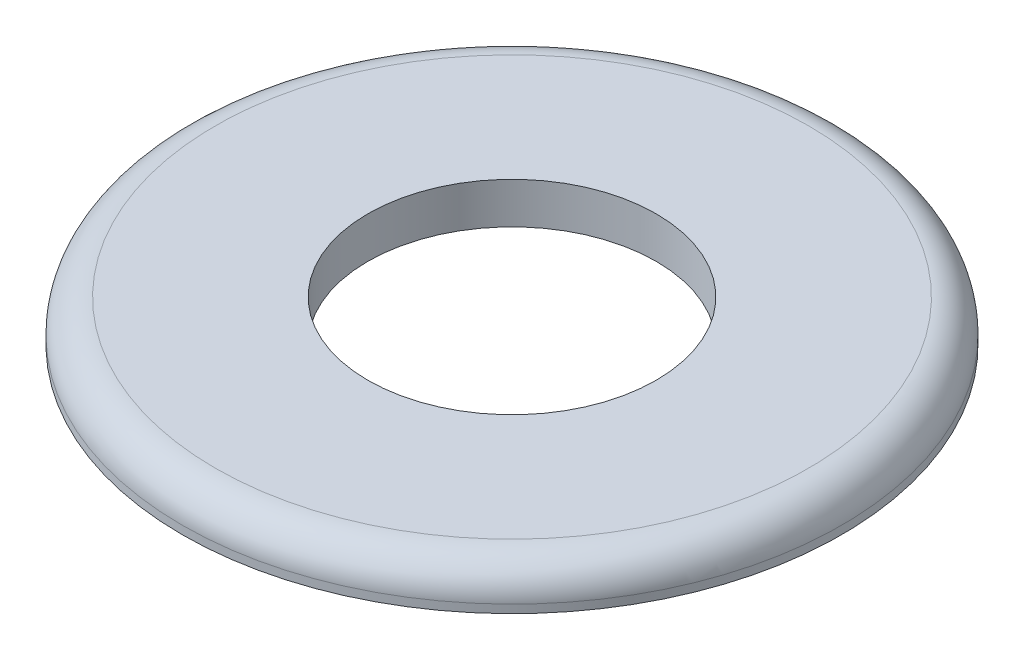
ISO-10303-21;
HEADER;
FILE_DESCRIPTION(('STEP AP214'),'2;1');
FILE_NAME('part.step','',(''),(''),'','','');
FILE_SCHEMA(('AUTOMOTIVE_DESIGN { 1 0 10303 214 1 1 1 1 }'));
ENDSEC;
DATA;
#1=APPLICATION_CONTEXT('core data for automotive mechanical design processes');
#2=APPLICATION_PROTOCOL_DEFINITION('international standard','automotive_design',2000,#1);
#3=PRODUCT_CONTEXT('',#1,'mechanical');
#4=PRODUCT('Part','Part','',(#3));
#5=PRODUCT_RELATED_PRODUCT_CATEGORY('part','',(#4));
#6=PRODUCT_DEFINITION_FORMATION('','',#4);
#7=PRODUCT_DEFINITION_CONTEXT('part definition',#1,'design');
#8=PRODUCT_DEFINITION('design','',#6,#7);
#9=PRODUCT_DEFINITION_SHAPE('','',#8);
#10=(LENGTH_UNIT() NAMED_UNIT(*) SI_UNIT(.MILLI.,.METRE.));
#11=(NAMED_UNIT(*) PLANE_ANGLE_UNIT() SI_UNIT($,.RADIAN.));
#12=(NAMED_UNIT(*) SI_UNIT($,.STERADIAN.) SOLID_ANGLE_UNIT());
#13=UNCERTAINTY_MEASURE_WITH_UNIT(LENGTH_MEASURE(1.E-05),#10,'distance_accuracy_value','');
#14=(GEOMETRIC_REPRESENTATION_CONTEXT(3) GLOBAL_UNCERTAINTY_ASSIGNED_CONTEXT((#13)) GLOBAL_UNIT_ASSIGNED_CONTEXT((#10,
#11,#12)) REPRESENTATION_CONTEXT('',''));
#15=CARTESIAN_POINT('',(0.,0.,0.));
#16=DIRECTION('',(0.,0.,1.));
#17=DIRECTION('',(1.,0.,0.));
#18=AXIS2_PLACEMENT_3D('',#15,#16,#17);
#19=CARTESIAN_POINT('',(0.,0.5,0.));
#20=DIRECTION('',(0.,1.,0.));
#21=DIRECTION('',(0.,0.,1.));
#22=AXIS2_PLACEMENT_3D('',#19,#20,#21);
#23=PLANE('',#22);
#24=CARTESIAN_POINT('',(0.,0.5,0.));
#25=DIRECTION('',(0.,1.,0.));
#26=DIRECTION('',(0.,0.,1.));
#27=AXIS2_PLACEMENT_3D('',#24,#25,#26);
#28=CIRCLE('',#27,3.6);
#29=CARTESIAN_POINT('',(0.,0.5,3.6));
#30=VERTEX_POINT('',#29);
#31=EDGE_CURVE('E47',#30,#30,#28,.T.);
#32=ORIENTED_EDGE('',*,*,#31,.T.);
#33=EDGE_LOOP('',(#32));
#34=FACE_BOUND('',#33,.T.);
#35=CARTESIAN_POINT('',(0.,0.5,0.));
#36=DIRECTION('',(0.,1.,0.));
#37=DIRECTION('',(0.,0.,1.));
#38=AXIS2_PLACEMENT_3D('',#35,#36,#37);
#39=CIRCLE('',#38,1.75);
#40=CARTESIAN_POINT('',(0.,0.5,1.75));
#41=VERTEX_POINT('',#40);
#42=EDGE_CURVE('E57',#41,#41,#39,.T.);
#43=ORIENTED_EDGE('',*,*,#42,.F.);
#44=EDGE_LOOP('',(#43));
#45=FACE_BOUND('',#44,.T.);
#46=ADVANCED_FACE('F39',(#34,#45),#23,.T.);
#47=CARTESIAN_POINT('',(0.,0.,0.));
#48=DIRECTION('',(0.,1.,0.));
#49=DIRECTION('',(0.,0.,1.));
#50=AXIS2_PLACEMENT_3D('',#47,#48,#49);
#51=PLANE('',#50);
#52=CARTESIAN_POINT('',(0.,0.,0.));
#53=DIRECTION('',(0.,1.,0.));
#54=DIRECTION('',(0.,0.,1.));
#55=AXIS2_PLACEMENT_3D('',#52,#53,#54);
#56=CIRCLE('',#55,4.);
#57=CARTESIAN_POINT('',(0.,0.,4.));
#58=VERTEX_POINT('',#57);
#59=EDGE_CURVE('E52',#58,#58,#56,.T.);
#60=ORIENTED_EDGE('',*,*,#59,.F.);
#61=EDGE_LOOP('',(#60));
#62=FACE_BOUND('',#61,.T.);
#63=CARTESIAN_POINT('',(0.,0.,0.));
#64=DIRECTION('',(0.,1.,0.));
#65=DIRECTION('',(0.,0.,1.));
#66=AXIS2_PLACEMENT_3D('',#63,#64,#65);
#67=CIRCLE('',#66,1.75);
#68=CARTESIAN_POINT('',(0.,0.,1.75));
#69=VERTEX_POINT('',#68);
#70=EDGE_CURVE('E60',#69,#69,#67,.T.);
#71=ORIENTED_EDGE('',*,*,#70,.T.);
#72=EDGE_LOOP('',(#71));
#73=FACE_BOUND('',#72,.T.);
#74=ADVANCED_FACE('F72',(#62,#73),#51,.F.);
#75=CARTESIAN_POINT('',(0.,0.5,0.));
#76=DIRECTION('',(0.,-1.,0.));
#77=DIRECTION('',(0.,0.,-1.));
#78=AXIS2_PLACEMENT_3D('',#75,#76,#77);
#79=CYLINDRICAL_SURFACE('',#78,4.);
#80=CARTESIAN_POINT('',(0.,0.1,0.));
#81=DIRECTION('',(0.,1.,0.));
#82=DIRECTION('',(0.,0.,1.));
#83=AXIS2_PLACEMENT_3D('',#80,#81,#82);
#84=CIRCLE('',#83,4.);
#85=CARTESIAN_POINT('',(0.,0.1,4.));
#86=VERTEX_POINT('',#85);
#87=EDGE_CURVE('E10',#86,#86,#84,.F.);
#88=ORIENTED_EDGE('',*,*,#87,.T.);
#89=EDGE_LOOP('',(#88));
#90=FACE_BOUND('',#89,.T.);
#91=ORIENTED_EDGE('',*,*,#59,.T.);
#92=EDGE_LOOP('',(#91));
#93=FACE_BOUND('',#92,.T.);
#94=ADVANCED_FACE('F77',(#90,#93),#79,.T.);
#95=CARTESIAN_POINT('',(0.,0.5,0.));
#96=DIRECTION('',(0.,-1.,0.));
#97=DIRECTION('',(0.,0.,-1.));
#98=AXIS2_PLACEMENT_3D('',#95,#96,#97);
#99=CYLINDRICAL_SURFACE('',#98,1.75);
#100=ORIENTED_EDGE('',*,*,#42,.T.);
#101=EDGE_LOOP('',(#100));
#102=FACE_BOUND('',#101,.T.);
#103=ORIENTED_EDGE('',*,*,#70,.F.);
#104=EDGE_LOOP('',(#103));
#105=FACE_BOUND('',#104,.T.);
#106=ADVANCED_FACE('F68',(#102,#105),#99,.F.);
#107=CARTESIAN_POINT('',(0.,0.1,0.));
#108=DIRECTION('',(0.,1.,0.));
#109=DIRECTION('',(0.,0.,1.));
#110=AXIS2_PLACEMENT_3D('',#107,#108,#109);
#111=TOROIDAL_SURFACE('',#110,3.6,0.4);
#112=ORIENTED_EDGE('',*,*,#87,.F.);
#113=EDGE_LOOP('',(#112));
#114=FACE_BOUND('',#113,.T.);
#115=ORIENTED_EDGE('',*,*,#31,.F.);
#116=EDGE_LOOP('',(#115));
#117=FACE_BOUND('',#116,.T.);
#118=ADVANCED_FACE('F41',(#114,#117),#111,.T.);
#119=CLOSED_SHELL('',(#46,#74,#94,#106,#118));
#120=MANIFOLD_SOLID_BREP('B2',#119);
#121=ADVANCED_BREP_SHAPE_REPRESENTATION('',(#18,#120),#14);
#122=SHAPE_DEFINITION_REPRESENTATION(#9,#121);
ENDSEC;
END-ISO-10303-21;
